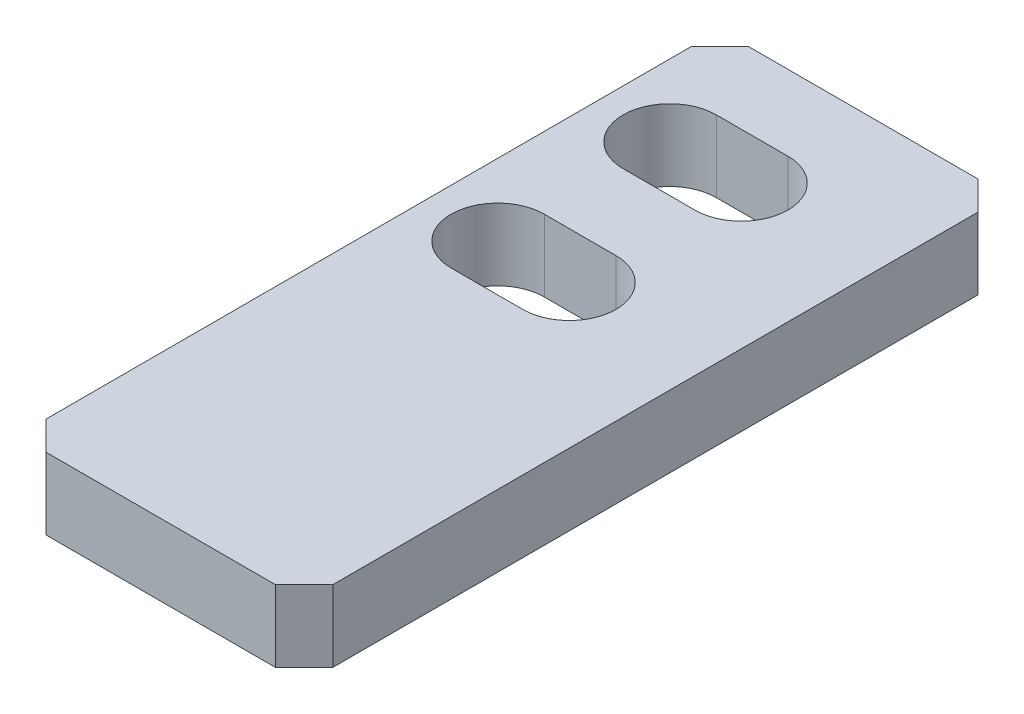
ISO-10303-21;
HEADER;
FILE_DESCRIPTION(('STEP AP214'),'2;1');
FILE_NAME('part.step','',(''),(''),'','','');
FILE_SCHEMA(('AUTOMOTIVE_DESIGN { 1 0 10303 214 1 1 1 1 }'));
ENDSEC;
DATA;
#1=APPLICATION_CONTEXT('core data for automotive mechanical design processes');
#2=APPLICATION_PROTOCOL_DEFINITION('international standard','automotive_design',2000,#1);
#3=PRODUCT_CONTEXT('',#1,'mechanical');
#4=PRODUCT('Part','Part','',(#3));
#5=PRODUCT_RELATED_PRODUCT_CATEGORY('part','',(#4));
#6=PRODUCT_DEFINITION_FORMATION('','',#4);
#7=PRODUCT_DEFINITION_CONTEXT('part definition',#1,'design');
#8=PRODUCT_DEFINITION('design','',#6,#7);
#9=PRODUCT_DEFINITION_SHAPE('','',#8);
#10=(LENGTH_UNIT() NAMED_UNIT(*) SI_UNIT(.MILLI.,.METRE.));
#11=(NAMED_UNIT(*) PLANE_ANGLE_UNIT() SI_UNIT($,.RADIAN.));
#12=(NAMED_UNIT(*) SI_UNIT($,.STERADIAN.) SOLID_ANGLE_UNIT());
#13=UNCERTAINTY_MEASURE_WITH_UNIT(LENGTH_MEASURE(1.E-05),#10,'distance_accuracy_value','');
#14=(GEOMETRIC_REPRESENTATION_CONTEXT(3) GLOBAL_UNCERTAINTY_ASSIGNED_CONTEXT((#13)) GLOBAL_UNIT_ASSIGNED_CONTEXT((#10,
#11,#12)) REPRESENTATION_CONTEXT('',''));
#15=CARTESIAN_POINT('',(0.,0.,0.));
#16=DIRECTION('',(0.,0.,1.));
#17=DIRECTION('',(1.,0.,0.));
#18=AXIS2_PLACEMENT_3D('',#15,#16,#17);
#19=CARTESIAN_POINT('',(0.,5.,0.));
#20=DIRECTION('',(0.,-1.,0.));
#21=DIRECTION('',(0.,0.,-1.));
#22=AXIS2_PLACEMENT_3D('',#19,#20,#21);
#23=PLANE('',#22);
#24=CARTESIAN_POINT('',(10.,5.,-40.5));
#25=DIRECTION('',(0.,1.,0.));
#26=DIRECTION('',(0.,0.,1.));
#27=AXIS2_PLACEMENT_3D('',#24,#25,#26);
#28=CIRCLE('',#27,3.25);
#29=CARTESIAN_POINT('',(10.,5.,-37.25));
#30=VERTEX_POINT('',#29);
#31=CARTESIAN_POINT('',(10.,5.,-43.75));
#32=VERTEX_POINT('',#31);
#33=EDGE_CURVE('E206',#30,#32,#28,.T.);
#34=ORIENTED_EDGE('',*,*,#33,.F.);
#35=DIRECTION('',(1.,0.,0.));
#36=VECTOR('',#35,1.);
#37=CARTESIAN_POINT('',(10.,5.,-37.25));
#38=LINE('',#37,#36);
#39=CARTESIAN_POINT('',(5.,5.,-37.25));
#40=VERTEX_POINT('',#39);
#41=EDGE_CURVE('E216',#40,#30,#38,.T.);
#42=ORIENTED_EDGE('',*,*,#41,.F.);
#43=CARTESIAN_POINT('',(5.,5.,-40.5));
#44=DIRECTION('',(0.,1.,0.));
#45=DIRECTION('',(0.,0.,1.));
#46=AXIS2_PLACEMENT_3D('',#43,#44,#45);
#47=CIRCLE('',#46,3.25);
#48=CARTESIAN_POINT('',(5.,5.,-43.75));
#49=VERTEX_POINT('',#48);
#50=EDGE_CURVE('E213',#49,#40,#47,.T.);
#51=ORIENTED_EDGE('',*,*,#50,.F.);
#52=DIRECTION('',(-1.,0.,0.));
#53=VECTOR('',#52,1.);
#54=CARTESIAN_POINT('',(10.,5.,-43.75));
#55=LINE('',#54,#53);
#56=EDGE_CURVE('E209',#32,#49,#55,.T.);
#57=ORIENTED_EDGE('',*,*,#56,.F.);
#58=EDGE_LOOP('',(#34,#42,#51,#57));
#59=FACE_BOUND('',#58,.T.);
#60=DIRECTION('',(0.707106781186546,0.,-0.707106781186549));
#61=VECTOR('',#60,1.);
#62=CARTESIAN_POINT('',(18.,5.,0.));
#63=LINE('',#62,#61);
#64=CARTESIAN_POINT('',(18.,5.,0.));
#65=VERTEX_POINT('',#64);
#66=CARTESIAN_POINT('',(20.,5.,-2.));
#67=VERTEX_POINT('',#66);
#68=EDGE_CURVE('E247',#65,#67,#63,.T.);
#69=ORIENTED_EDGE('',*,*,#68,.T.);
#70=DIRECTION('',(0.,0.,-1.));
#71=VECTOR('',#70,1.);
#72=CARTESIAN_POINT('',(20.,5.,-2.));
#73=LINE('',#72,#71);
#74=CARTESIAN_POINT('',(20.,5.,-47.));
#75=VERTEX_POINT('',#74);
#76=EDGE_CURVE('E251',#67,#75,#73,.T.);
#77=ORIENTED_EDGE('',*,*,#76,.T.);
#78=DIRECTION('',(0.707106781186552,0.,0.707106781186543));
#79=VECTOR('',#78,1.);
#80=CARTESIAN_POINT('',(18.,5.,-49.));
#81=LINE('',#80,#79);
#82=CARTESIAN_POINT('',(18.,5.,-49.));
#83=VERTEX_POINT('',#82);
#84=EDGE_CURVE('E255',#83,#75,#81,.T.);
#85=ORIENTED_EDGE('',*,*,#84,.F.);
#86=DIRECTION('',(1.,0.,0.));
#87=VECTOR('',#86,1.);
#88=CARTESIAN_POINT('',(1.99999999999999,5.,-49.));
#89=LINE('',#88,#87);
#90=CARTESIAN_POINT('',(1.99999999999999,5.,-49.));
#91=VERTEX_POINT('',#90);
#92=EDGE_CURVE('E259',#91,#83,#89,.T.);
#93=ORIENTED_EDGE('',*,*,#92,.F.);
#94=DIRECTION('',(0.707106781186546,0.,-0.707106781186549));
#95=VECTOR('',#94,1.);
#96=CARTESIAN_POINT('',(0.,5.,-47.));
#97=LINE('',#96,#95);
#98=CARTESIAN_POINT('',(0.,5.,-47.));
#99=VERTEX_POINT('',#98);
#100=EDGE_CURVE('E263',#99,#91,#97,.T.);
#101=ORIENTED_EDGE('',*,*,#100,.F.);
#102=DIRECTION('',(0.,0.,-1.));
#103=VECTOR('',#102,1.);
#104=CARTESIAN_POINT('',(0.,5.,-1.99999999999999));
#105=LINE('',#104,#103);
#106=CARTESIAN_POINT('',(0.,5.,-1.99999999999999));
#107=VERTEX_POINT('',#106);
#108=EDGE_CURVE('E267',#107,#99,#105,.T.);
#109=ORIENTED_EDGE('',*,*,#108,.F.);
#110=DIRECTION('',(0.707106781186549,0.,0.707106781186546));
#111=VECTOR('',#110,1.);
#112=CARTESIAN_POINT('',(0.,5.,-1.99999999999999));
#113=LINE('',#112,#111);
#114=CARTESIAN_POINT('',(2.,5.,0.));
#115=VERTEX_POINT('',#114);
#116=EDGE_CURVE('E271',#107,#115,#113,.T.);
#117=ORIENTED_EDGE('',*,*,#116,.T.);
#118=DIRECTION('',(1.,0.,0.));
#119=VECTOR('',#118,1.);
#120=CARTESIAN_POINT('',(2.,5.,0.));
#121=LINE('',#120,#119);
#122=EDGE_CURVE('E274',#115,#65,#121,.T.);
#123=ORIENTED_EDGE('',*,*,#122,.T.);
#124=EDGE_LOOP('',(#69,#77,#85,#93,#101,#109,#117,#123));
#125=FACE_BOUND('',#124,.T.);
#126=CARTESIAN_POINT('',(5.,5.,-28.5));
#127=DIRECTION('',(0.,1.,0.));
#128=DIRECTION('',(0.,0.,1.));
#129=AXIS2_PLACEMENT_3D('',#126,#127,#128);
#130=CIRCLE('',#129,3.25);
#131=CARTESIAN_POINT('',(5.,5.,-31.75));
#132=VERTEX_POINT('',#131);
#133=CARTESIAN_POINT('',(5.,5.,-25.25));
#134=VERTEX_POINT('',#133);
#135=EDGE_CURVE('E155',#132,#134,#130,.T.);
#136=ORIENTED_EDGE('',*,*,#135,.F.);
#137=DIRECTION('',(-1.,0.,0.));
#138=VECTOR('',#137,1.);
#139=CARTESIAN_POINT('',(5.,5.,-31.75));
#140=LINE('',#139,#138);
#141=CARTESIAN_POINT('',(10.,5.,-31.75));
#142=VERTEX_POINT('',#141);
#143=EDGE_CURVE('E183',#142,#132,#140,.T.);
#144=ORIENTED_EDGE('',*,*,#143,.F.);
#145=CARTESIAN_POINT('',(10.,5.,-28.5));
#146=DIRECTION('',(0.,1.,0.));
#147=DIRECTION('',(0.,0.,1.));
#148=AXIS2_PLACEMENT_3D('',#145,#146,#147);
#149=CIRCLE('',#148,3.25);
#150=CARTESIAN_POINT('',(10.,5.,-25.25));
#151=VERTEX_POINT('',#150);
#152=EDGE_CURVE('E179',#151,#142,#149,.T.);
#153=ORIENTED_EDGE('',*,*,#152,.F.);
#154=DIRECTION('',(1.,0.,0.));
#155=VECTOR('',#154,1.);
#156=CARTESIAN_POINT('',(5.,5.,-25.25));
#157=LINE('',#156,#155);
#158=EDGE_CURVE('E166',#134,#151,#157,.T.);
#159=ORIENTED_EDGE('',*,*,#158,.F.);
#160=EDGE_LOOP('',(#136,#144,#153,#159));
#161=FACE_BOUND('',#160,.T.);
#162=ADVANCED_FACE('F40',(#59,#125,#161),#23,.F.);
#163=CARTESIAN_POINT('',(0.,0.,0.));
#164=DIRECTION('',(0.,-1.,0.));
#165=DIRECTION('',(0.,0.,-1.));
#166=AXIS2_PLACEMENT_3D('',#163,#164,#165);
#167=PLANE('',#166);
#168=DIRECTION('',(0.707106781186546,0.,-0.707106781186549));
#169=VECTOR('',#168,1.);
#170=CARTESIAN_POINT('',(18.,0.,0.));
#171=LINE('',#170,#169);
#172=CARTESIAN_POINT('',(18.,0.,0.));
#173=VERTEX_POINT('',#172);
#174=CARTESIAN_POINT('',(20.,0.,-2.));
#175=VERTEX_POINT('',#174);
#176=EDGE_CURVE('E246',#173,#175,#171,.T.);
#177=ORIENTED_EDGE('',*,*,#176,.F.);
#178=DIRECTION('',(1.,0.,0.));
#179=VECTOR('',#178,1.);
#180=CARTESIAN_POINT('',(2.,0.,0.));
#181=LINE('',#180,#179);
#182=CARTESIAN_POINT('',(2.,0.,0.));
#183=VERTEX_POINT('',#182);
#184=EDGE_CURVE('E252',#183,#173,#181,.T.);
#185=ORIENTED_EDGE('',*,*,#184,.F.);
#186=DIRECTION('',(0.707106781186549,0.,0.707106781186546));
#187=VECTOR('',#186,1.);
#188=CARTESIAN_POINT('',(0.,0.,-1.99999999999999));
#189=LINE('',#188,#187);
#190=CARTESIAN_POINT('',(0.,0.,-1.99999999999999));
#191=VERTEX_POINT('',#190);
#192=EDGE_CURVE('E301',#191,#183,#189,.T.);
#193=ORIENTED_EDGE('',*,*,#192,.F.);
#194=DIRECTION('',(0.,0.,-1.));
#195=VECTOR('',#194,1.);
#196=CARTESIAN_POINT('',(0.,0.,-1.99999999999999));
#197=LINE('',#196,#195);
#198=CARTESIAN_POINT('',(0.,0.,-47.));
#199=VERTEX_POINT('',#198);
#200=EDGE_CURVE('E297',#191,#199,#197,.T.);
#201=ORIENTED_EDGE('',*,*,#200,.T.);
#202=DIRECTION('',(0.707106781186546,0.,-0.707106781186549));
#203=VECTOR('',#202,1.);
#204=CARTESIAN_POINT('',(0.,0.,-47.));
#205=LINE('',#204,#203);
#206=CARTESIAN_POINT('',(1.99999999999999,0.,-49.));
#207=VERTEX_POINT('',#206);
#208=EDGE_CURVE('E293',#199,#207,#205,.T.);
#209=ORIENTED_EDGE('',*,*,#208,.T.);
#210=DIRECTION('',(1.,0.,0.));
#211=VECTOR('',#210,1.);
#212=CARTESIAN_POINT('',(1.99999999999999,0.,-49.));
#213=LINE('',#212,#211);
#214=CARTESIAN_POINT('',(18.,0.,-49.));
#215=VERTEX_POINT('',#214);
#216=EDGE_CURVE('E289',#207,#215,#213,.T.);
#217=ORIENTED_EDGE('',*,*,#216,.T.);
#218=DIRECTION('',(0.707106781186552,0.,0.707106781186543));
#219=VECTOR('',#218,1.);
#220=CARTESIAN_POINT('',(18.,0.,-49.));
#221=LINE('',#220,#219);
#222=CARTESIAN_POINT('',(20.,0.,-47.));
#223=VERTEX_POINT('',#222);
#224=EDGE_CURVE('E285',#215,#223,#221,.T.);
#225=ORIENTED_EDGE('',*,*,#224,.T.);
#226=DIRECTION('',(0.,0.,-1.));
#227=VECTOR('',#226,1.);
#228=CARTESIAN_POINT('',(20.,0.,-2.));
#229=LINE('',#228,#227);
#230=EDGE_CURVE('E281',#175,#223,#229,.T.);
#231=ORIENTED_EDGE('',*,*,#230,.F.);
#232=EDGE_LOOP('',(#177,#185,#193,#201,#209,#217,#225,#231));
#233=FACE_BOUND('',#232,.T.);
#234=DIRECTION('',(1.,0.,0.));
#235=VECTOR('',#234,1.);
#236=CARTESIAN_POINT('',(10.,0.,-37.25));
#237=LINE('',#236,#235);
#238=CARTESIAN_POINT('',(5.,0.,-37.25));
#239=VERTEX_POINT('',#238);
#240=CARTESIAN_POINT('',(10.,0.,-37.25));
#241=VERTEX_POINT('',#240);
#242=EDGE_CURVE('E210',#239,#241,#237,.T.);
#243=ORIENTED_EDGE('',*,*,#242,.T.);
#244=CARTESIAN_POINT('',(10.,0.,-40.5));
#245=DIRECTION('',(0.,1.,0.));
#246=DIRECTION('',(0.,0.,1.));
#247=AXIS2_PLACEMENT_3D('',#244,#245,#246);
#248=CIRCLE('',#247,3.25);
#249=CARTESIAN_POINT('',(10.,0.,-43.75));
#250=VERTEX_POINT('',#249);
#251=EDGE_CURVE('E175',#241,#250,#248,.T.);
#252=ORIENTED_EDGE('',*,*,#251,.T.);
#253=DIRECTION('',(-1.,0.,0.));
#254=VECTOR('',#253,1.);
#255=CARTESIAN_POINT('',(10.,0.,-43.75));
#256=LINE('',#255,#254);
#257=CARTESIAN_POINT('',(5.,0.,-43.75));
#258=VERTEX_POINT('',#257);
#259=EDGE_CURVE('E223',#250,#258,#256,.T.);
#260=ORIENTED_EDGE('',*,*,#259,.T.);
#261=CARTESIAN_POINT('',(5.,0.,-40.5));
#262=DIRECTION('',(0.,1.,0.));
#263=DIRECTION('',(0.,0.,1.));
#264=AXIS2_PLACEMENT_3D('',#261,#262,#263);
#265=CIRCLE('',#264,3.25);
#266=EDGE_CURVE('E227',#258,#239,#265,.T.);
#267=ORIENTED_EDGE('',*,*,#266,.T.);
#268=EDGE_LOOP('',(#243,#252,#260,#267));
#269=FACE_BOUND('',#268,.T.);
#270=DIRECTION('',(-1.,0.,0.));
#271=VECTOR('',#270,1.);
#272=CARTESIAN_POINT('',(5.,0.,-31.75));
#273=LINE('',#272,#271);
#274=CARTESIAN_POINT('',(10.,0.,-31.75));
#275=VERTEX_POINT('',#274);
#276=CARTESIAN_POINT('',(5.,0.,-31.75));
#277=VERTEX_POINT('',#276);
#278=EDGE_CURVE('E167',#275,#277,#273,.T.);
#279=ORIENTED_EDGE('',*,*,#278,.T.);
#280=CARTESIAN_POINT('',(5.,0.,-28.5));
#281=DIRECTION('',(0.,1.,0.));
#282=DIRECTION('',(0.,0.,1.));
#283=AXIS2_PLACEMENT_3D('',#280,#281,#282);
#284=CIRCLE('',#283,3.25);
#285=CARTESIAN_POINT('',(5.,0.,-25.25));
#286=VERTEX_POINT('',#285);
#287=EDGE_CURVE('E188',#277,#286,#284,.T.);
#288=ORIENTED_EDGE('',*,*,#287,.T.);
#289=DIRECTION('',(1.,0.,0.));
#290=VECTOR('',#289,1.);
#291=CARTESIAN_POINT('',(5.,0.,-25.25));
#292=LINE('',#291,#290);
#293=CARTESIAN_POINT('',(10.,0.,-25.25));
#294=VERTEX_POINT('',#293);
#295=EDGE_CURVE('E173',#286,#294,#292,.T.);
#296=ORIENTED_EDGE('',*,*,#295,.T.);
#297=CARTESIAN_POINT('',(10.,0.,-28.5));
#298=DIRECTION('',(0.,1.,0.));
#299=DIRECTION('',(0.,0.,1.));
#300=AXIS2_PLACEMENT_3D('',#297,#298,#299);
#301=CIRCLE('',#300,3.25);
#302=EDGE_CURVE('E193',#294,#275,#301,.T.);
#303=ORIENTED_EDGE('',*,*,#302,.T.);
#304=EDGE_LOOP('',(#279,#288,#296,#303));
#305=FACE_BOUND('',#304,.T.);
#306=ADVANCED_FACE('F335',(#233,#269,#305),#167,.T.);
#307=CARTESIAN_POINT('',(18.,5.,0.));
#308=DIRECTION('',(-0.707106781186549,0.,-0.707106781186546));
#309=DIRECTION('',(-0.707106781186546,0.,0.707106781186549));
#310=AXIS2_PLACEMENT_3D('',#307,#308,#309);
#311=PLANE('',#310);
#312=ORIENTED_EDGE('',*,*,#176,.T.);
#313=DIRECTION('',(0.,-1.,0.));
#314=VECTOR('',#313,1.);
#315=CARTESIAN_POINT('',(20.,5.,-2.));
#316=LINE('',#315,#314);
#317=EDGE_CURVE('E12',#67,#175,#316,.T.);
#318=ORIENTED_EDGE('',*,*,#317,.F.);
#319=ORIENTED_EDGE('',*,*,#68,.F.);
#320=DIRECTION('',(0.,-1.,0.));
#321=VECTOR('',#320,1.);
#322=CARTESIAN_POINT('',(18.,5.,0.));
#323=LINE('',#322,#321);
#324=EDGE_CURVE('E277',#65,#173,#323,.T.);
#325=ORIENTED_EDGE('',*,*,#324,.T.);
#326=EDGE_LOOP('',(#312,#318,#319,#325));
#327=FACE_BOUND('',#326,.T.);
#328=ADVANCED_FACE('F42',(#327),#311,.F.);
#329=CARTESIAN_POINT('',(20.,5.,-2.));
#330=DIRECTION('',(-1.,0.,0.));
#331=DIRECTION('',(0.,0.,1.));
#332=AXIS2_PLACEMENT_3D('',#329,#330,#331);
#333=PLANE('',#332);
#334=ORIENTED_EDGE('',*,*,#230,.T.);
#335=DIRECTION('',(0.,-1.,0.));
#336=VECTOR('',#335,1.);
#337=CARTESIAN_POINT('',(20.,5.,-47.));
#338=LINE('',#337,#336);
#339=EDGE_CURVE('E49',#75,#223,#338,.T.);
#340=ORIENTED_EDGE('',*,*,#339,.F.);
#341=ORIENTED_EDGE('',*,*,#76,.F.);
#342=ORIENTED_EDGE('',*,*,#317,.T.);
#343=EDGE_LOOP('',(#334,#340,#341,#342));
#344=FACE_BOUND('',#343,.T.);
#345=ADVANCED_FACE('F331',(#344),#333,.F.);
#346=CARTESIAN_POINT('',(18.,5.,-49.));
#347=DIRECTION('',(0.707106781186543,0.,-0.707106781186552));
#348=DIRECTION('',(-0.707106781186552,0.,-0.707106781186543));
#349=AXIS2_PLACEMENT_3D('',#346,#347,#348);
#350=PLANE('',#349);
#351=ORIENTED_EDGE('',*,*,#224,.F.);
#352=DIRECTION('',(0.,-1.,0.));
#353=VECTOR('',#352,1.);
#354=CARTESIAN_POINT('',(18.,5.,-49.));
#355=LINE('',#354,#353);
#356=EDGE_CURVE('E322',#83,#215,#355,.T.);
#357=ORIENTED_EDGE('',*,*,#356,.F.);
#358=ORIENTED_EDGE('',*,*,#84,.T.);
#359=ORIENTED_EDGE('',*,*,#339,.T.);
#360=EDGE_LOOP('',(#351,#357,#358,#359));
#361=FACE_BOUND('',#360,.T.);
#362=ADVANCED_FACE('F328',(#361),#350,.T.);
#363=CARTESIAN_POINT('',(1.99999999999999,5.,-49.));
#364=DIRECTION('',(0.,0.,-1.));
#365=DIRECTION('',(-1.,0.,0.));
#366=AXIS2_PLACEMENT_3D('',#363,#364,#365);
#367=PLANE('',#366);
#368=ORIENTED_EDGE('',*,*,#216,.F.);
#369=DIRECTION('',(0.,-1.,0.));
#370=VECTOR('',#369,1.);
#371=CARTESIAN_POINT('',(1.99999999999999,5.,-49.));
#372=LINE('',#371,#370);
#373=EDGE_CURVE('E319',#91,#207,#372,.T.);
#374=ORIENTED_EDGE('',*,*,#373,.F.);
#375=ORIENTED_EDGE('',*,*,#92,.T.);
#376=ORIENTED_EDGE('',*,*,#356,.T.);
#377=EDGE_LOOP('',(#368,#374,#375,#376));
#378=FACE_BOUND('',#377,.T.);
#379=ADVANCED_FACE('F340',(#378),#367,.T.);
#380=CARTESIAN_POINT('',(0.,5.,-47.));
#381=DIRECTION('',(-0.707106781186549,0.,-0.707106781186546));
#382=DIRECTION('',(-0.707106781186546,0.,0.707106781186549));
#383=AXIS2_PLACEMENT_3D('',#380,#381,#382);
#384=PLANE('',#383);
#385=ORIENTED_EDGE('',*,*,#208,.F.);
#386=DIRECTION('',(0.,-1.,0.));
#387=VECTOR('',#386,1.);
#388=CARTESIAN_POINT('',(0.,5.,-47.));
#389=LINE('',#388,#387);
#390=EDGE_CURVE('E316',#99,#199,#389,.T.);
#391=ORIENTED_EDGE('',*,*,#390,.F.);
#392=ORIENTED_EDGE('',*,*,#100,.T.);
#393=ORIENTED_EDGE('',*,*,#373,.T.);
#394=EDGE_LOOP('',(#385,#391,#392,#393));
#395=FACE_BOUND('',#394,.T.);
#396=ADVANCED_FACE('F361',(#395),#384,.T.);
#397=CARTESIAN_POINT('',(0.,5.,-1.99999999999999));
#398=DIRECTION('',(-1.,0.,0.));
#399=DIRECTION('',(0.,0.,1.));
#400=AXIS2_PLACEMENT_3D('',#397,#398,#399);
#401=PLANE('',#400);
#402=ORIENTED_EDGE('',*,*,#200,.F.);
#403=DIRECTION('',(0.,-1.,0.));
#404=VECTOR('',#403,1.);
#405=CARTESIAN_POINT('',(0.,5.,-1.99999999999999));
#406=LINE('',#405,#404);
#407=EDGE_CURVE('E313',#107,#191,#406,.T.);
#408=ORIENTED_EDGE('',*,*,#407,.F.);
#409=ORIENTED_EDGE('',*,*,#108,.T.);
#410=ORIENTED_EDGE('',*,*,#390,.T.);
#411=EDGE_LOOP('',(#402,#408,#409,#410));
#412=FACE_BOUND('',#411,.T.);
#413=ADVANCED_FACE('F359',(#412),#401,.T.);
#414=CARTESIAN_POINT('',(0.,5.,-1.99999999999999));
#415=DIRECTION('',(0.707106781186546,0.,-0.707106781186549));
#416=DIRECTION('',(-0.707106781186549,0.,-0.707106781186546));
#417=AXIS2_PLACEMENT_3D('',#414,#415,#416);
#418=PLANE('',#417);
#419=ORIENTED_EDGE('',*,*,#192,.T.);
#420=DIRECTION('',(0.,-1.,0.));
#421=VECTOR('',#420,1.);
#422=CARTESIAN_POINT('',(2.,5.,0.));
#423=LINE('',#422,#421);
#424=EDGE_CURVE('E309',#115,#183,#423,.T.);
#425=ORIENTED_EDGE('',*,*,#424,.F.);
#426=ORIENTED_EDGE('',*,*,#116,.F.);
#427=ORIENTED_EDGE('',*,*,#407,.T.);
#428=EDGE_LOOP('',(#419,#425,#426,#427));
#429=FACE_BOUND('',#428,.T.);
#430=ADVANCED_FACE('F356',(#429),#418,.F.);
#431=CARTESIAN_POINT('',(2.,5.,0.));
#432=DIRECTION('',(0.,0.,-1.));
#433=DIRECTION('',(-1.,0.,0.));
#434=AXIS2_PLACEMENT_3D('',#431,#432,#433);
#435=PLANE('',#434);
#436=ORIENTED_EDGE('',*,*,#184,.T.);
#437=ORIENTED_EDGE('',*,*,#324,.F.);
#438=ORIENTED_EDGE('',*,*,#122,.F.);
#439=ORIENTED_EDGE('',*,*,#424,.T.);
#440=EDGE_LOOP('',(#436,#437,#438,#439));
#441=FACE_BOUND('',#440,.T.);
#442=ADVANCED_FACE('F352',(#441),#435,.F.);
#443=CARTESIAN_POINT('',(10.,5.,-40.5));
#444=DIRECTION('',(0.,-1.,0.));
#445=DIRECTION('',(0.,0.,-1.));
#446=AXIS2_PLACEMENT_3D('',#443,#444,#445);
#447=CYLINDRICAL_SURFACE('',#446,3.25);
#448=ORIENTED_EDGE('',*,*,#251,.F.);
#449=DIRECTION('',(0.,-1.,0.));
#450=VECTOR('',#449,1.);
#451=CARTESIAN_POINT('',(10.,5.,-37.25));
#452=LINE('',#451,#450);
#453=EDGE_CURVE('E219',#30,#241,#452,.T.);
#454=ORIENTED_EDGE('',*,*,#453,.F.);
#455=ORIENTED_EDGE('',*,*,#33,.T.);
#456=DIRECTION('',(0.,-1.,0.));
#457=VECTOR('',#456,1.);
#458=CARTESIAN_POINT('',(10.,5.,-43.75));
#459=LINE('',#458,#457);
#460=EDGE_CURVE('E242',#32,#250,#459,.T.);
#461=ORIENTED_EDGE('',*,*,#460,.T.);
#462=EDGE_LOOP('',(#448,#454,#455,#461));
#463=FACE_BOUND('',#462,.T.);
#464=ADVANCED_FACE('F379',(#463),#447,.F.);
#465=CARTESIAN_POINT('',(10.,5.,-43.75));
#466=DIRECTION('',(0.,0.,1.));
#467=DIRECTION('',(1.,0.,0.));
#468=AXIS2_PLACEMENT_3D('',#465,#466,#467);
#469=PLANE('',#468);
#470=ORIENTED_EDGE('',*,*,#259,.F.);
#471=ORIENTED_EDGE('',*,*,#460,.F.);
#472=ORIENTED_EDGE('',*,*,#56,.T.);
#473=DIRECTION('',(0.,-1.,0.));
#474=VECTOR('',#473,1.);
#475=CARTESIAN_POINT('',(5.,5.,-43.75));
#476=LINE('',#475,#474);
#477=EDGE_CURVE('E239',#49,#258,#476,.T.);
#478=ORIENTED_EDGE('',*,*,#477,.T.);
#479=EDGE_LOOP('',(#470,#471,#472,#478));
#480=FACE_BOUND('',#479,.T.);
#481=ADVANCED_FACE('F399',(#480),#469,.T.);
#482=CARTESIAN_POINT('',(5.,5.,-40.5));
#483=DIRECTION('',(0.,-1.,0.));
#484=DIRECTION('',(0.,0.,-1.));
#485=AXIS2_PLACEMENT_3D('',#482,#483,#484);
#486=CYLINDRICAL_SURFACE('',#485,3.25);
#487=ORIENTED_EDGE('',*,*,#266,.F.);
#488=ORIENTED_EDGE('',*,*,#477,.F.);
#489=ORIENTED_EDGE('',*,*,#50,.T.);
#490=DIRECTION('',(0.,-1.,0.));
#491=VECTOR('',#490,1.);
#492=CARTESIAN_POINT('',(5.,5.,-37.25));
#493=LINE('',#492,#491);
#494=EDGE_CURVE('E64',#40,#239,#493,.T.);
#495=ORIENTED_EDGE('',*,*,#494,.T.);
#496=EDGE_LOOP('',(#487,#488,#489,#495));
#497=FACE_BOUND('',#496,.T.);
#498=ADVANCED_FACE('F407',(#497),#486,.F.);
#499=CARTESIAN_POINT('',(10.,5.,-37.25));
#500=DIRECTION('',(0.,0.,-1.));
#501=DIRECTION('',(-1.,0.,0.));
#502=AXIS2_PLACEMENT_3D('',#499,#500,#501);
#503=PLANE('',#502);
#504=ORIENTED_EDGE('',*,*,#242,.F.);
#505=ORIENTED_EDGE('',*,*,#494,.F.);
#506=ORIENTED_EDGE('',*,*,#41,.T.);
#507=ORIENTED_EDGE('',*,*,#453,.T.);
#508=EDGE_LOOP('',(#504,#505,#506,#507));
#509=FACE_BOUND('',#508,.T.);
#510=ADVANCED_FACE('F414',(#509),#503,.T.);
#511=CARTESIAN_POINT('',(5.,5.,-28.5));
#512=DIRECTION('',(0.,-1.,0.));
#513=DIRECTION('',(0.,0.,-1.));
#514=AXIS2_PLACEMENT_3D('',#511,#512,#513);
#515=CYLINDRICAL_SURFACE('',#514,3.25);
#516=ORIENTED_EDGE('',*,*,#287,.F.);
#517=DIRECTION('',(0.,-1.,0.));
#518=VECTOR('',#517,1.);
#519=CARTESIAN_POINT('',(5.,5.,-31.75));
#520=LINE('',#519,#518);
#521=EDGE_CURVE('E161',#132,#277,#520,.T.);
#522=ORIENTED_EDGE('',*,*,#521,.F.);
#523=ORIENTED_EDGE('',*,*,#135,.T.);
#524=DIRECTION('',(0.,-1.,0.));
#525=VECTOR('',#524,1.);
#526=CARTESIAN_POINT('',(5.,5.,-25.25));
#527=LINE('',#526,#525);
#528=EDGE_CURVE('E158',#134,#286,#527,.T.);
#529=ORIENTED_EDGE('',*,*,#528,.T.);
#530=EDGE_LOOP('',(#516,#522,#523,#529));
#531=FACE_BOUND('',#530,.T.);
#532=ADVANCED_FACE('F157',(#531),#515,.F.);
#533=CARTESIAN_POINT('',(5.,5.,-25.25));
#534=DIRECTION('',(0.,0.,-1.));
#535=DIRECTION('',(-1.,0.,0.));
#536=AXIS2_PLACEMENT_3D('',#533,#534,#535);
#537=PLANE('',#536);
#538=ORIENTED_EDGE('',*,*,#295,.F.);
#539=ORIENTED_EDGE('',*,*,#528,.F.);
#540=ORIENTED_EDGE('',*,*,#158,.T.);
#541=DIRECTION('',(0.,-1.,0.));
#542=VECTOR('',#541,1.);
#543=CARTESIAN_POINT('',(10.,5.,-25.25));
#544=LINE('',#543,#542);
#545=EDGE_CURVE('E176',#151,#294,#544,.T.);
#546=ORIENTED_EDGE('',*,*,#545,.T.);
#547=EDGE_LOOP('',(#538,#539,#540,#546));
#548=FACE_BOUND('',#547,.T.);
#549=ADVANCED_FACE('F170',(#548),#537,.T.);
#550=CARTESIAN_POINT('',(10.,5.,-28.5));
#551=DIRECTION('',(0.,-1.,0.));
#552=DIRECTION('',(0.,0.,-1.));
#553=AXIS2_PLACEMENT_3D('',#550,#551,#552);
#554=CYLINDRICAL_SURFACE('',#553,3.25);
#555=ORIENTED_EDGE('',*,*,#302,.F.);
#556=ORIENTED_EDGE('',*,*,#545,.F.);
#557=ORIENTED_EDGE('',*,*,#152,.T.);
#558=DIRECTION('',(0.,-1.,0.));
#559=VECTOR('',#558,1.);
#560=CARTESIAN_POINT('',(10.,5.,-31.75));
#561=LINE('',#560,#559);
#562=EDGE_CURVE('E56',#142,#275,#561,.T.);
#563=ORIENTED_EDGE('',*,*,#562,.T.);
#564=EDGE_LOOP('',(#555,#556,#557,#563));
#565=FACE_BOUND('',#564,.T.);
#566=ADVANCED_FACE('F434',(#565),#554,.F.);
#567=CARTESIAN_POINT('',(5.,5.,-31.75));
#568=DIRECTION('',(0.,0.,1.));
#569=DIRECTION('',(1.,0.,0.));
#570=AXIS2_PLACEMENT_3D('',#567,#568,#569);
#571=PLANE('',#570);
#572=ORIENTED_EDGE('',*,*,#278,.F.);
#573=ORIENTED_EDGE('',*,*,#562,.F.);
#574=ORIENTED_EDGE('',*,*,#143,.T.);
#575=ORIENTED_EDGE('',*,*,#521,.T.);
#576=EDGE_LOOP('',(#572,#573,#574,#575));
#577=FACE_BOUND('',#576,.T.);
#578=ADVANCED_FACE('F441',(#577),#571,.T.);
#579=CLOSED_SHELL('',(#162,#306,#328,#345,#362,#379,#396,#413,#430,#442,#464,#481,#498,#510,
#532,#549,#566,#578));
#580=MANIFOLD_SOLID_BREP('B2',#579);
#581=ADVANCED_BREP_SHAPE_REPRESENTATION('',(#18,#580),#14);
#582=SHAPE_DEFINITION_REPRESENTATION(#9,#581);
ENDSEC;
END-ISO-10303-21;
